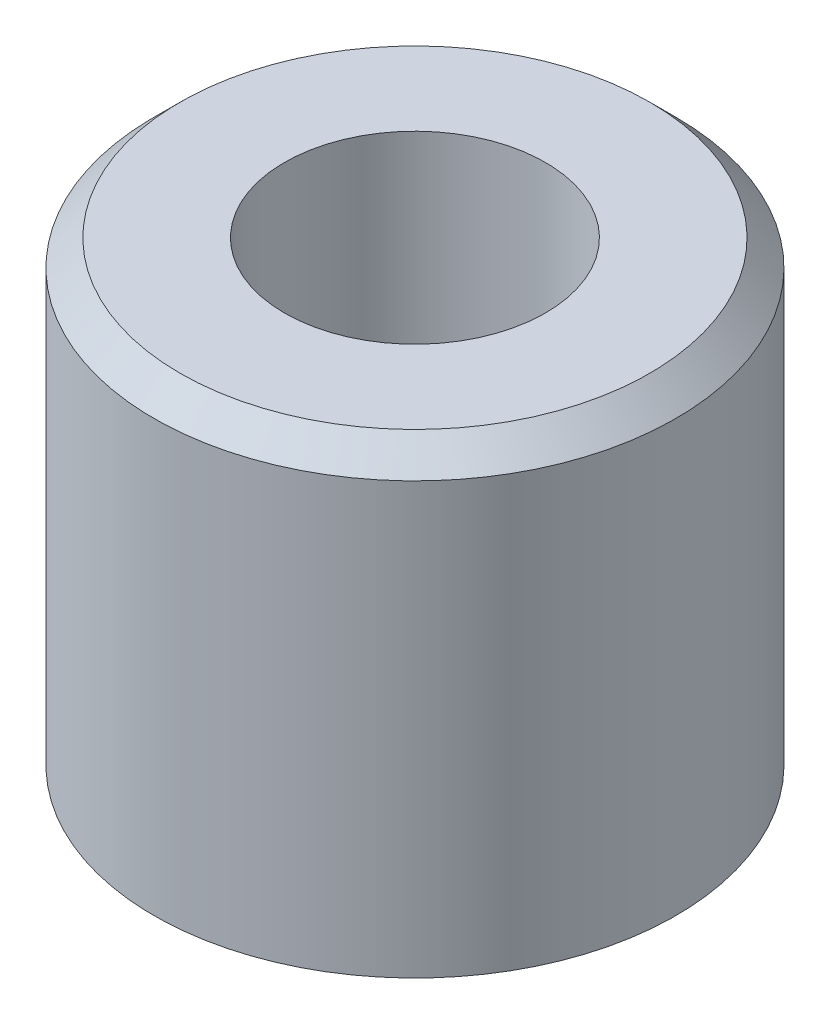
ISO-10303-21;
HEADER;
FILE_DESCRIPTION(('STEP AP214'),'2;1');
FILE_NAME('part.step','',(''),(''),'','','');
FILE_SCHEMA(('AUTOMOTIVE_DESIGN { 1 0 10303 214 1 1 1 1 }'));
ENDSEC;
DATA;
#1=APPLICATION_CONTEXT('core data for automotive mechanical design processes');
#2=APPLICATION_PROTOCOL_DEFINITION('international standard','automotive_design',2000,#1);
#3=PRODUCT_CONTEXT('',#1,'mechanical');
#4=PRODUCT('Part','Part','',(#3));
#5=PRODUCT_RELATED_PRODUCT_CATEGORY('part','',(#4));
#6=PRODUCT_DEFINITION_FORMATION('','',#4);
#7=PRODUCT_DEFINITION_CONTEXT('part definition',#1,'design');
#8=PRODUCT_DEFINITION('design','',#6,#7);
#9=PRODUCT_DEFINITION_SHAPE('','',#8);
#10=(LENGTH_UNIT() NAMED_UNIT(*) SI_UNIT(.MILLI.,.METRE.));
#11=(NAMED_UNIT(*) PLANE_ANGLE_UNIT() SI_UNIT($,.RADIAN.));
#12=(NAMED_UNIT(*) SI_UNIT($,.STERADIAN.) SOLID_ANGLE_UNIT());
#13=UNCERTAINTY_MEASURE_WITH_UNIT(LENGTH_MEASURE(1.E-05),#10,'distance_accuracy_value','');
#14=(GEOMETRIC_REPRESENTATION_CONTEXT(3) GLOBAL_UNCERTAINTY_ASSIGNED_CONTEXT((#13)) GLOBAL_UNIT_ASSIGNED_CONTEXT((#10,
#11,#12)) REPRESENTATION_CONTEXT('',''));
#15=CARTESIAN_POINT('',(0.,0.,0.));
#16=DIRECTION('',(0.,0.,1.));
#17=DIRECTION('',(1.,0.,0.));
#18=AXIS2_PLACEMENT_3D('',#15,#16,#17);
#19=CARTESIAN_POINT('',(0.,5.95,0.));
#20=DIRECTION('',(0.,1.,0.));
#21=DIRECTION('',(0.,0.,1.));
#22=AXIS2_PLACEMENT_3D('',#19,#20,#21);
#23=CYLINDRICAL_SURFACE('',#22,3.4);
#24=CARTESIAN_POINT('',(0.,5.95,0.));
#25=DIRECTION('',(0.,1.,0.));
#26=DIRECTION('',(0.,0.,1.));
#27=AXIS2_PLACEMENT_3D('',#24,#25,#26);
#28=CIRCLE('',#27,3.4);
#29=CARTESIAN_POINT('',(0.,5.95,3.4));
#30=VERTEX_POINT('',#29);
#31=EDGE_CURVE('E60',#30,#30,#28,.F.);
#32=ORIENTED_EDGE('',*,*,#31,.F.);
#33=EDGE_LOOP('',(#32));
#34=FACE_BOUND('',#33,.T.);
#35=CARTESIAN_POINT('',(0.,-0.850000000000001,0.));
#36=DIRECTION('',(0.,1.,0.));
#37=DIRECTION('',(0.,0.,1.));
#38=AXIS2_PLACEMENT_3D('',#35,#36,#37);
#39=CIRCLE('',#38,3.4);
#40=CARTESIAN_POINT('',(0.,-0.850000000000001,3.4));
#41=VERTEX_POINT('',#40);
#42=EDGE_CURVE('E41',#41,#41,#39,.F.);
#43=ORIENTED_EDGE('',*,*,#42,.T.);
#44=EDGE_LOOP('',(#43));
#45=FACE_BOUND('',#44,.T.);
#46=ADVANCED_FACE('F38',(#34,#45),#23,.F.);
#47=CARTESIAN_POINT('',(2.21,-0.850000000000001,0.));
#48=DIRECTION('',(0.,-1.,0.));
#49=DIRECTION('',(0.,0.,-1.));
#50=AXIS2_PLACEMENT_3D('',#47,#48,#49);
#51=PLANE('',#50);
#52=ORIENTED_EDGE('',*,*,#42,.F.);
#53=EDGE_LOOP('',(#52));
#54=FACE_BOUND('',#53,.T.);
#55=CARTESIAN_POINT('',(0.,-0.850000000000001,0.));
#56=DIRECTION('',(0.,1.,0.));
#57=DIRECTION('',(0.,0.,1.));
#58=AXIS2_PLACEMENT_3D('',#55,#56,#57);
#59=CIRCLE('',#58,2.21);
#60=CARTESIAN_POINT('',(0.,-0.850000000000001,2.21));
#61=VERTEX_POINT('',#60);
#62=EDGE_CURVE('E58',#61,#61,#59,.F.);
#63=ORIENTED_EDGE('',*,*,#62,.T.);
#64=EDGE_LOOP('',(#63));
#65=FACE_BOUND('',#64,.T.);
#66=ADVANCED_FACE('F68',(#54,#65),#51,.F.);
#67=CARTESIAN_POINT('',(0.,5.95,0.));
#68=DIRECTION('',(0.,1.,0.));
#69=DIRECTION('',(0.,0.,1.));
#70=AXIS2_PLACEMENT_3D('',#67,#68,#69);
#71=PLANE('',#70);
#72=CARTESIAN_POINT('',(0.,5.95,0.));
#73=DIRECTION('',(0.,-1.,0.));
#74=DIRECTION('',(0.,0.,-1.));
#75=AXIS2_PLACEMENT_3D('',#72,#73,#74);
#76=CIRCLE('',#75,6.12);
#77=CARTESIAN_POINT('',(0.,5.95,-6.12));
#78=VERTEX_POINT('',#77);
#79=EDGE_CURVE('E55',#78,#78,#76,.T.);
#80=ORIENTED_EDGE('',*,*,#79,.F.);
#81=EDGE_LOOP('',(#80));
#82=FACE_BOUND('',#81,.T.);
#83=ORIENTED_EDGE('',*,*,#31,.T.);
#84=EDGE_LOOP('',(#83));
#85=FACE_BOUND('',#84,.T.);
#86=ADVANCED_FACE('F71',(#82,#85),#71,.T.);
#87=CARTESIAN_POINT('',(0.,5.95,0.));
#88=DIRECTION('',(0.,1.,0.));
#89=DIRECTION('',(0.,0.,1.));
#90=AXIS2_PLACEMENT_3D('',#87,#88,#89);
#91=CYLINDRICAL_SURFACE('',#90,2.21);
#92=CARTESIAN_POINT('',(0.,-5.95,0.));
#93=DIRECTION('',(0.,1.,0.));
#94=DIRECTION('',(0.,0.,1.));
#95=AXIS2_PLACEMENT_3D('',#92,#93,#94);
#96=CIRCLE('',#95,2.21);
#97=CARTESIAN_POINT('',(0.,-5.95,2.21));
#98=VERTEX_POINT('',#97);
#99=EDGE_CURVE('E50',#98,#98,#96,.F.);
#100=ORIENTED_EDGE('',*,*,#99,.T.);
#101=EDGE_LOOP('',(#100));
#102=FACE_BOUND('',#101,.T.);
#103=ORIENTED_EDGE('',*,*,#62,.F.);
#104=EDGE_LOOP('',(#103));
#105=FACE_BOUND('',#104,.T.);
#106=ADVANCED_FACE('F74',(#102,#105),#91,.F.);
#107=CARTESIAN_POINT('',(0.,5.27,0.));
#108=DIRECTION('',(0.,-1.,0.));
#109=DIRECTION('',(0.,0.,-1.));
#110=AXIS2_PLACEMENT_3D('',#107,#108,#109);
#111=CONICAL_SURFACE('',#110,6.8,0.785398163397448);
#112=CARTESIAN_POINT('',(0.,5.27,0.));
#113=DIRECTION('',(0.,-1.,0.));
#114=DIRECTION('',(0.,0.,-1.));
#115=AXIS2_PLACEMENT_3D('',#112,#113,#114);
#116=CIRCLE('',#115,6.8);
#117=CARTESIAN_POINT('',(0.,5.27,-6.8));
#118=VERTEX_POINT('',#117);
#119=EDGE_CURVE('E45',#118,#118,#116,.T.);
#120=ORIENTED_EDGE('',*,*,#119,.F.);
#121=EDGE_LOOP('',(#120));
#122=FACE_BOUND('',#121,.T.);
#123=ORIENTED_EDGE('',*,*,#79,.T.);
#124=EDGE_LOOP('',(#123));
#125=FACE_BOUND('',#124,.T.);
#126=ADVANCED_FACE('F76',(#122,#125),#111,.T.);
#127=CARTESIAN_POINT('',(0.,-5.95,0.));
#128=DIRECTION('',(0.,1.,0.));
#129=DIRECTION('',(0.,0.,1.));
#130=AXIS2_PLACEMENT_3D('',#127,#128,#129);
#131=PLANE('',#130);
#132=CARTESIAN_POINT('',(0.,-5.95,0.));
#133=DIRECTION('',(0.,-1.,0.));
#134=DIRECTION('',(0.,0.,-1.));
#135=AXIS2_PLACEMENT_3D('',#132,#133,#134);
#136=CIRCLE('',#135,6.8);
#137=CARTESIAN_POINT('',(0.,-5.95,-6.8));
#138=VERTEX_POINT('',#137);
#139=EDGE_CURVE('E10',#138,#138,#136,.F.);
#140=ORIENTED_EDGE('',*,*,#139,.F.);
#141=EDGE_LOOP('',(#140));
#142=FACE_BOUND('',#141,.T.);
#143=ORIENTED_EDGE('',*,*,#99,.F.);
#144=EDGE_LOOP('',(#143));
#145=FACE_BOUND('',#144,.T.);
#146=ADVANCED_FACE('F83',(#142,#145),#131,.F.);
#147=CARTESIAN_POINT('',(0.,5.95,0.));
#148=DIRECTION('',(0.,-1.,0.));
#149=DIRECTION('',(0.,0.,-1.));
#150=AXIS2_PLACEMENT_3D('',#147,#148,#149);
#151=CYLINDRICAL_SURFACE('',#150,6.8);
#152=ORIENTED_EDGE('',*,*,#139,.T.);
#153=EDGE_LOOP('',(#152));
#154=FACE_BOUND('',#153,.T.);
#155=ORIENTED_EDGE('',*,*,#119,.T.);
#156=EDGE_LOOP('',(#155));
#157=FACE_BOUND('',#156,.T.);
#158=ADVANCED_FACE('F88',(#154,#157),#151,.T.);
#159=CLOSED_SHELL('',(#46,#66,#86,#106,#126,#146,#158));
#160=MANIFOLD_SOLID_BREP('B2',#159);
#161=ADVANCED_BREP_SHAPE_REPRESENTATION('',(#18,#160),#14);
#162=SHAPE_DEFINITION_REPRESENTATION(#9,#161);
ENDSEC;
END-ISO-10303-21;
